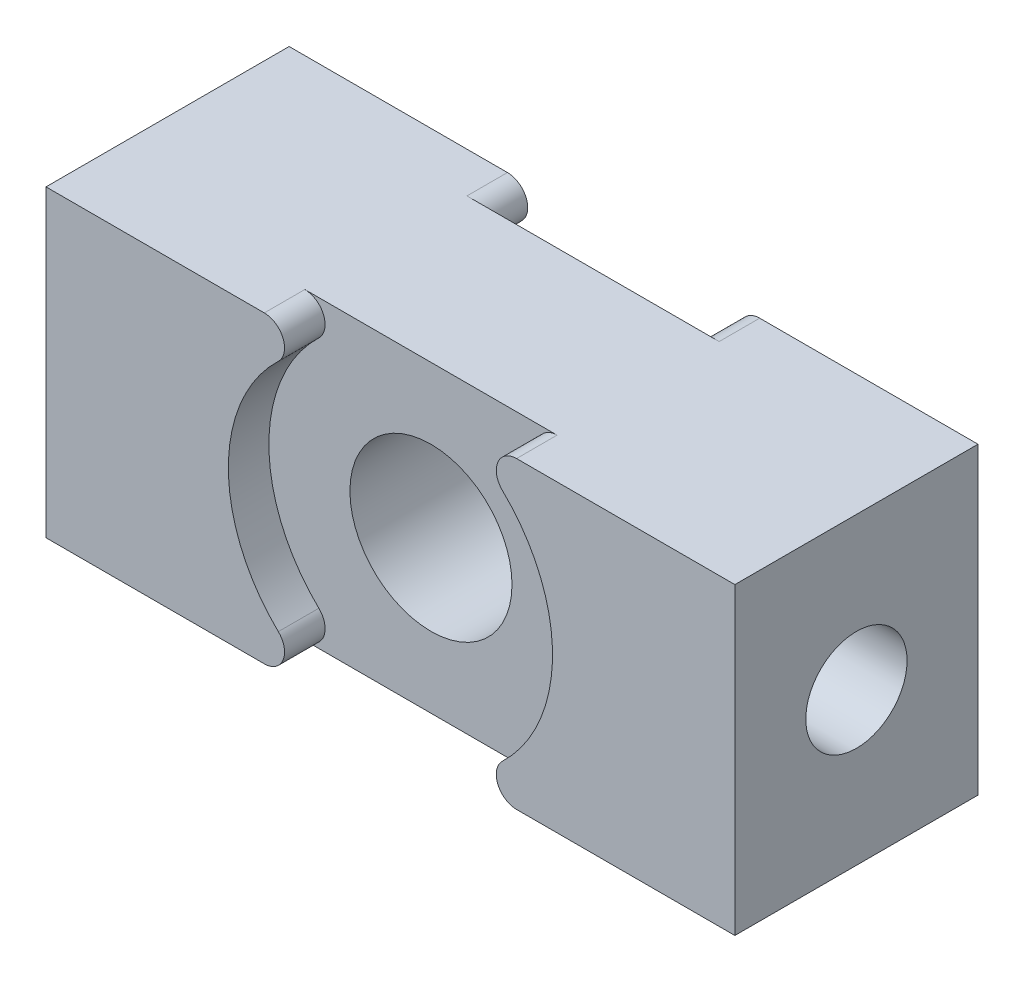
ISO-10303-21;
HEADER;
FILE_DESCRIPTION(('STEP AP214'),'2;1');
FILE_NAME('part.step','',(''),(''),'','','');
FILE_SCHEMA(('AUTOMOTIVE_DESIGN { 1 0 10303 214 1 1 1 1 }'));
ENDSEC;
DATA;
#1=APPLICATION_CONTEXT('core data for automotive mechanical design processes');
#2=APPLICATION_PROTOCOL_DEFINITION('international standard','automotive_design',2000,#1);
#3=PRODUCT_CONTEXT('',#1,'mechanical');
#4=PRODUCT('Part','Part','',(#3));
#5=PRODUCT_RELATED_PRODUCT_CATEGORY('part','',(#4));
#6=PRODUCT_DEFINITION_FORMATION('','',#4);
#7=PRODUCT_DEFINITION_CONTEXT('part definition',#1,'design');
#8=PRODUCT_DEFINITION('design','',#6,#7);
#9=PRODUCT_DEFINITION_SHAPE('','',#8);
#10=(LENGTH_UNIT() NAMED_UNIT(*) SI_UNIT(.MILLI.,.METRE.));
#11=(NAMED_UNIT(*) PLANE_ANGLE_UNIT() SI_UNIT($,.RADIAN.));
#12=(NAMED_UNIT(*) SI_UNIT($,.STERADIAN.) SOLID_ANGLE_UNIT());
#13=UNCERTAINTY_MEASURE_WITH_UNIT(LENGTH_MEASURE(1.E-05),#10,'distance_accuracy_value','');
#14=(GEOMETRIC_REPRESENTATION_CONTEXT(3) GLOBAL_UNCERTAINTY_ASSIGNED_CONTEXT((#13)) GLOBAL_UNIT_ASSIGNED_CONTEXT((#10,
#11,#12)) REPRESENTATION_CONTEXT('',''));
#15=CARTESIAN_POINT('',(0.,0.,0.));
#16=DIRECTION('',(0.,0.,1.));
#17=DIRECTION('',(1.,0.,0.));
#18=AXIS2_PLACEMENT_3D('',#15,#16,#17);
#19=CARTESIAN_POINT('',(0.,7.5,6.));
#20=DIRECTION('',(0.,0.,-1.));
#21=DIRECTION('',(-1.,0.,0.));
#22=AXIS2_PLACEMENT_3D('',#19,#20,#21);
#23=CYLINDRICAL_SURFACE('',#22,4.);
#24=CARTESIAN_POINT('',(0.,7.5,4.));
#25=DIRECTION('',(0.,0.,1.));
#26=DIRECTION('',(1.,0.,0.));
#27=AXIS2_PLACEMENT_3D('',#24,#25,#26);
#28=CIRCLE('',#27,4.);
#29=CARTESIAN_POINT('',(4.,7.5,4.));
#30=VERTEX_POINT('',#29);
#31=EDGE_CURVE('E258',#30,#30,#28,.F.);
#32=ORIENTED_EDGE('',*,*,#31,.F.);
#33=EDGE_LOOP('',(#32));
#34=FACE_BOUND('',#33,.T.);
#35=CARTESIAN_POINT('',(0.,7.5,-4.));
#36=DIRECTION('',(0.,0.,-1.));
#37=DIRECTION('',(-1.,0.,0.));
#38=AXIS2_PLACEMENT_3D('',#35,#36,#37);
#39=CIRCLE('',#38,4.);
#40=CARTESIAN_POINT('',(-4.,7.5,-4.));
#41=VERTEX_POINT('',#40);
#42=EDGE_CURVE('E380',#41,#41,#39,.F.);
#43=ORIENTED_EDGE('',*,*,#42,.F.);
#44=EDGE_LOOP('',(#43));
#45=FACE_BOUND('',#44,.T.);
#46=ADVANCED_FACE('F56',(#34,#45),#23,.F.);
#47=CARTESIAN_POINT('',(-17.,15.,-6.));
#48=DIRECTION('',(0.,0.,1.));
#49=DIRECTION('',(1.,0.,0.));
#50=AXIS2_PLACEMENT_3D('',#47,#48,#49);
#51=PLANE('',#50);
#52=DIRECTION('',(-1.,0.,0.));
#53=VECTOR('',#52,1.);
#54=CARTESIAN_POINT('',(-17.,15.,-6.));
#55=LINE('',#54,#53);
#56=CARTESIAN_POINT('',(-6.22494979899437,15.,-6.));
#57=VERTEX_POINT('',#56);
#58=CARTESIAN_POINT('',(-17.,15.,-6.));
#59=VERTEX_POINT('',#58);
#60=EDGE_CURVE('E223',#57,#59,#55,.T.);
#61=ORIENTED_EDGE('',*,*,#60,.F.);
#62=CARTESIAN_POINT('',(-6.22494979899437,14.,-6.));
#63=DIRECTION('',(0.,0.,1.));
#64=DIRECTION('',(1.,0.,0.));
#65=AXIS2_PLACEMENT_3D('',#62,#63,#64);
#66=CIRCLE('',#65,1.);
#67=CARTESIAN_POINT('',(-5.53328871021722,13.2777777777778,-6.));
#68=VERTEX_POINT('',#67);
#69=EDGE_CURVE('E311',#57,#68,#66,.F.);
#70=ORIENTED_EDGE('',*,*,#69,.T.);
#71=CARTESIAN_POINT('',(0.,7.5,-6.));
#72=DIRECTION('',(0.,0.,-1.));
#73=DIRECTION('',(-1.,0.,0.));
#74=AXIS2_PLACEMENT_3D('',#71,#72,#73);
#75=CIRCLE('',#74,8.);
#76=CARTESIAN_POINT('',(-5.53328871021722,1.72222222222222,-6.));
#77=VERTEX_POINT('',#76);
#78=EDGE_CURVE('E399',#77,#68,#75,.T.);
#79=ORIENTED_EDGE('',*,*,#78,.F.);
#80=CARTESIAN_POINT('',(-6.22494979899437,1.,-6.));
#81=DIRECTION('',(0.,0.,1.));
#82=DIRECTION('',(1.,0.,0.));
#83=AXIS2_PLACEMENT_3D('',#80,#81,#82);
#84=CIRCLE('',#83,1.);
#85=CARTESIAN_POINT('',(-6.22494979899437,0.,-6.));
#86=VERTEX_POINT('',#85);
#87=EDGE_CURVE('E309',#77,#86,#84,.F.);
#88=ORIENTED_EDGE('',*,*,#87,.T.);
#89=DIRECTION('',(-1.,0.,0.));
#90=VECTOR('',#89,1.);
#91=CARTESIAN_POINT('',(-17.,0.,-6.));
#92=LINE('',#91,#90);
#93=CARTESIAN_POINT('',(-17.,0.,-6.));
#94=VERTEX_POINT('',#93);
#95=EDGE_CURVE('E237',#86,#94,#92,.T.);
#96=ORIENTED_EDGE('',*,*,#95,.T.);
#97=DIRECTION('',(0.,-1.,0.));
#98=VECTOR('',#97,1.);
#99=CARTESIAN_POINT('',(-17.,15.,-6.));
#100=LINE('',#99,#98);
#101=EDGE_CURVE('E251',#59,#94,#100,.T.);
#102=ORIENTED_EDGE('',*,*,#101,.F.);
#103=EDGE_LOOP('',(#61,#70,#79,#88,#96,#102));
#104=FACE_BOUND('',#103,.T.);
#105=ADVANCED_FACE('F409',(#104),#51,.F.);
#106=CARTESIAN_POINT('',(-17.,15.,6.));
#107=DIRECTION('',(0.,0.,-1.));
#108=DIRECTION('',(-1.,0.,0.));
#109=AXIS2_PLACEMENT_3D('',#106,#107,#108);
#110=PLANE('',#109);
#111=CARTESIAN_POINT('',(0.,7.5,6.));
#112=DIRECTION('',(0.,0.,1.));
#113=DIRECTION('',(1.,0.,0.));
#114=AXIS2_PLACEMENT_3D('',#111,#112,#113);
#115=CIRCLE('',#114,8.);
#116=CARTESIAN_POINT('',(5.53328871021722,1.72222222222222,6.));
#117=VERTEX_POINT('',#116);
#118=CARTESIAN_POINT('',(5.53328871021722,13.2777777777778,6.));
#119=VERTEX_POINT('',#118);
#120=EDGE_CURVE('E377',#117,#119,#115,.T.);
#121=ORIENTED_EDGE('',*,*,#120,.F.);
#122=CARTESIAN_POINT('',(6.22494979899437,1.,6.));
#123=DIRECTION('',(0.,0.,-1.));
#124=DIRECTION('',(-1.,0.,0.));
#125=AXIS2_PLACEMENT_3D('',#122,#123,#124);
#126=CIRCLE('',#125,1.);
#127=CARTESIAN_POINT('',(6.22494979899437,0.,6.));
#128=VERTEX_POINT('',#127);
#129=EDGE_CURVE('E292',#117,#128,#126,.F.);
#130=ORIENTED_EDGE('',*,*,#129,.T.);
#131=DIRECTION('',(1.,0.,0.));
#132=VECTOR('',#131,1.);
#133=CARTESIAN_POINT('',(-17.,0.,6.));
#134=LINE('',#133,#132);
#135=CARTESIAN_POINT('',(17.,0.,6.));
#136=VERTEX_POINT('',#135);
#137=EDGE_CURVE('E243',#128,#136,#134,.T.);
#138=ORIENTED_EDGE('',*,*,#137,.T.);
#139=DIRECTION('',(0.,-1.,0.));
#140=VECTOR('',#139,1.);
#141=CARTESIAN_POINT('',(17.,15.,6.));
#142=LINE('',#141,#140);
#143=CARTESIAN_POINT('',(17.,15.,6.));
#144=VERTEX_POINT('',#143);
#145=EDGE_CURVE('E234',#144,#136,#142,.T.);
#146=ORIENTED_EDGE('',*,*,#145,.F.);
#147=DIRECTION('',(1.,0.,0.));
#148=VECTOR('',#147,1.);
#149=CARTESIAN_POINT('',(-17.,15.,6.));
#150=LINE('',#149,#148);
#151=CARTESIAN_POINT('',(6.22494979899437,15.,6.));
#152=VERTEX_POINT('',#151);
#153=EDGE_CURVE('E230',#152,#144,#150,.T.);
#154=ORIENTED_EDGE('',*,*,#153,.F.);
#155=CARTESIAN_POINT('',(6.22494979899437,14.,6.));
#156=DIRECTION('',(0.,0.,-1.));
#157=DIRECTION('',(-1.,0.,0.));
#158=AXIS2_PLACEMENT_3D('',#155,#156,#157);
#159=CIRCLE('',#158,1.);
#160=EDGE_CURVE('E290',#152,#119,#159,.F.);
#161=ORIENTED_EDGE('',*,*,#160,.T.);
#162=EDGE_LOOP('',(#121,#130,#138,#146,#154,#161));
#163=FACE_BOUND('',#162,.T.);
#164=ADVANCED_FACE('F392',(#163),#110,.F.);
#165=CARTESIAN_POINT('',(17.,15.,-6.));
#166=DIRECTION('',(-1.,0.,0.));
#167=DIRECTION('',(0.,0.,1.));
#168=AXIS2_PLACEMENT_3D('',#165,#166,#167);
#169=PLANE('',#168);
#170=CARTESIAN_POINT('',(17.,7.5,0.));
#171=DIRECTION('',(1.,0.,0.));
#172=DIRECTION('',(0.,0.,-1.));
#173=AXIS2_PLACEMENT_3D('',#170,#171,#172);
#174=CIRCLE('',#173,2.5);
#175=CARTESIAN_POINT('',(17.,7.5,-2.5));
#176=VERTEX_POINT('',#175);
#177=EDGE_CURVE('E207',#176,#176,#174,.T.);
#178=ORIENTED_EDGE('',*,*,#177,.F.);
#179=EDGE_LOOP('',(#178));
#180=FACE_BOUND('',#179,.T.);
#181=DIRECTION('',(0.,0.,-1.));
#182=VECTOR('',#181,1.);
#183=CARTESIAN_POINT('',(17.,0.,-6.));
#184=LINE('',#183,#182);
#185=CARTESIAN_POINT('',(17.,0.,-6.));
#186=VERTEX_POINT('',#185);
#187=EDGE_CURVE('E219',#136,#186,#184,.T.);
#188=ORIENTED_EDGE('',*,*,#187,.T.);
#189=DIRECTION('',(0.,-1.,0.));
#190=VECTOR('',#189,1.);
#191=CARTESIAN_POINT('',(17.,15.,-6.));
#192=LINE('',#191,#190);
#193=CARTESIAN_POINT('',(17.,15.,-6.));
#194=VERTEX_POINT('',#193);
#195=EDGE_CURVE('E254',#194,#186,#192,.T.);
#196=ORIENTED_EDGE('',*,*,#195,.F.);
#197=DIRECTION('',(0.,0.,-1.));
#198=VECTOR('',#197,1.);
#199=CARTESIAN_POINT('',(17.,15.,-6.));
#200=LINE('',#199,#198);
#201=EDGE_CURVE('E220',#144,#194,#200,.T.);
#202=ORIENTED_EDGE('',*,*,#201,.F.);
#203=ORIENTED_EDGE('',*,*,#145,.T.);
#204=EDGE_LOOP('',(#188,#196,#202,#203));
#205=FACE_BOUND('',#204,.T.);
#206=ADVANCED_FACE('F353',(#180,#205),#169,.F.);
#207=CARTESIAN_POINT('',(6.22494979899437,0.,-6.));
#208=VERTEX_POINT('',#207);
#209=EDGE_CURVE('E238',#186,#208,#92,.T.);
#210=ORIENTED_EDGE('',*,*,#209,.T.);
#211=CARTESIAN_POINT('',(6.22494979899437,1.,-6.));
#212=DIRECTION('',(0.,0.,1.));
#213=DIRECTION('',(1.,0.,0.));
#214=AXIS2_PLACEMENT_3D('',#211,#212,#213);
#215=CIRCLE('',#214,1.);
#216=CARTESIAN_POINT('',(5.53328871021722,1.72222222222222,-6.));
#217=VERTEX_POINT('',#216);
#218=EDGE_CURVE('E315',#208,#217,#215,.F.);
#219=ORIENTED_EDGE('',*,*,#218,.T.);
#220=CARTESIAN_POINT('',(5.53328871021722,13.2777777777778,-6.));
#221=VERTEX_POINT('',#220);
#222=EDGE_CURVE('E397',#221,#217,#75,.T.);
#223=ORIENTED_EDGE('',*,*,#222,.F.);
#224=CARTESIAN_POINT('',(6.22494979899437,14.,-6.));
#225=DIRECTION('',(0.,0.,1.));
#226=DIRECTION('',(1.,0.,0.));
#227=AXIS2_PLACEMENT_3D('',#224,#225,#226);
#228=CIRCLE('',#227,1.);
#229=CARTESIAN_POINT('',(6.22494979899437,15.,-6.));
#230=VERTEX_POINT('',#229);
#231=EDGE_CURVE('E313',#221,#230,#228,.F.);
#232=ORIENTED_EDGE('',*,*,#231,.T.);
#233=EDGE_CURVE('E225',#194,#230,#55,.T.);
#234=ORIENTED_EDGE('',*,*,#233,.F.);
#235=ORIENTED_EDGE('',*,*,#195,.T.);
#236=EDGE_LOOP('',(#210,#219,#223,#232,#234,#235));
#237=FACE_BOUND('',#236,.T.);
#238=ADVANCED_FACE('F348',(#237),#51,.F.);
#239=CARTESIAN_POINT('',(-17.,15.,-6.));
#240=DIRECTION('',(1.,0.,0.));
#241=DIRECTION('',(0.,0.,-1.));
#242=AXIS2_PLACEMENT_3D('',#239,#240,#241);
#243=PLANE('',#242);
#244=CARTESIAN_POINT('',(-17.,7.5,0.));
#245=DIRECTION('',(-1.,0.,0.));
#246=DIRECTION('',(0.,0.,1.));
#247=AXIS2_PLACEMENT_3D('',#244,#245,#246);
#248=CIRCLE('',#247,2.5);
#249=CARTESIAN_POINT('',(-17.,7.5,2.5));
#250=VERTEX_POINT('',#249);
#251=EDGE_CURVE('E206',#250,#250,#248,.T.);
#252=ORIENTED_EDGE('',*,*,#251,.F.);
#253=EDGE_LOOP('',(#252));
#254=FACE_BOUND('',#253,.T.);
#255=DIRECTION('',(0.,0.,1.));
#256=VECTOR('',#255,1.);
#257=CARTESIAN_POINT('',(-17.,0.,-6.));
#258=LINE('',#257,#256);
#259=CARTESIAN_POINT('',(-17.,0.,6.));
#260=VERTEX_POINT('',#259);
#261=EDGE_CURVE('E241',#94,#260,#258,.T.);
#262=ORIENTED_EDGE('',*,*,#261,.T.);
#263=DIRECTION('',(0.,-1.,0.));
#264=VECTOR('',#263,1.);
#265=CARTESIAN_POINT('',(-17.,15.,6.));
#266=LINE('',#265,#264);
#267=CARTESIAN_POINT('',(-17.,15.,6.));
#268=VERTEX_POINT('',#267);
#269=EDGE_CURVE('E248',#268,#260,#266,.T.);
#270=ORIENTED_EDGE('',*,*,#269,.F.);
#271=DIRECTION('',(0.,0.,1.));
#272=VECTOR('',#271,1.);
#273=CARTESIAN_POINT('',(-17.,15.,-6.));
#274=LINE('',#273,#272);
#275=EDGE_CURVE('E228',#59,#268,#274,.T.);
#276=ORIENTED_EDGE('',*,*,#275,.F.);
#277=ORIENTED_EDGE('',*,*,#101,.T.);
#278=EDGE_LOOP('',(#262,#270,#276,#277));
#279=FACE_BOUND('',#278,.T.);
#280=ADVANCED_FACE('F430',(#254,#279),#243,.F.);
#281=CARTESIAN_POINT('',(-6.22494979899437,0.,6.));
#282=VERTEX_POINT('',#281);
#283=EDGE_CURVE('E224',#260,#282,#134,.T.);
#284=ORIENTED_EDGE('',*,*,#283,.T.);
#285=CARTESIAN_POINT('',(-6.22494979899437,1.,6.));
#286=DIRECTION('',(0.,0.,-1.));
#287=DIRECTION('',(-1.,0.,0.));
#288=AXIS2_PLACEMENT_3D('',#285,#286,#287);
#289=CIRCLE('',#288,1.);
#290=CARTESIAN_POINT('',(-5.53328871021722,1.72222222222222,6.));
#291=VERTEX_POINT('',#290);
#292=EDGE_CURVE('E278',#282,#291,#289,.F.);
#293=ORIENTED_EDGE('',*,*,#292,.T.);
#294=CARTESIAN_POINT('',(-5.53328871021722,13.2777777777778,6.));
#295=VERTEX_POINT('',#294);
#296=EDGE_CURVE('E373',#295,#291,#115,.T.);
#297=ORIENTED_EDGE('',*,*,#296,.F.);
#298=CARTESIAN_POINT('',(-6.22494979899437,14.,6.));
#299=DIRECTION('',(0.,0.,-1.));
#300=DIRECTION('',(-1.,0.,0.));
#301=AXIS2_PLACEMENT_3D('',#298,#299,#300);
#302=CIRCLE('',#301,1.);
#303=CARTESIAN_POINT('',(-6.22494979899437,15.,6.));
#304=VERTEX_POINT('',#303);
#305=EDGE_CURVE('E276',#295,#304,#302,.F.);
#306=ORIENTED_EDGE('',*,*,#305,.T.);
#307=EDGE_CURVE('E231',#268,#304,#150,.T.);
#308=ORIENTED_EDGE('',*,*,#307,.F.);
#309=ORIENTED_EDGE('',*,*,#269,.T.);
#310=EDGE_LOOP('',(#284,#293,#297,#306,#308,#309));
#311=FACE_BOUND('',#310,.T.);
#312=ADVANCED_FACE('F425',(#311),#110,.F.);
#313=CARTESIAN_POINT('',(0.,15.,0.));
#314=DIRECTION('',(0.,1.,0.));
#315=DIRECTION('',(0.,0.,1.));
#316=AXIS2_PLACEMENT_3D('',#313,#314,#315);
#317=PLANE('',#316);
#318=DIRECTION('',(1.,0.,0.));
#319=VECTOR('',#318,1.);
#320=CARTESIAN_POINT('',(0.,15.,4.));
#321=LINE('',#320,#319);
#322=CARTESIAN_POINT('',(-6.22494979899437,15.,4.));
#323=VERTEX_POINT('',#322);
#324=CARTESIAN_POINT('',(6.22494979899437,15.,4.));
#325=VERTEX_POINT('',#324);
#326=EDGE_CURVE('E213',#323,#325,#321,.T.);
#327=ORIENTED_EDGE('',*,*,#326,.T.);
#328=DIRECTION('',(0.,0.,-1.));
#329=VECTOR('',#328,1.);
#330=CARTESIAN_POINT('',(6.22494979899437,15.,6.));
#331=LINE('',#330,#329);
#332=EDGE_CURVE('E302',#325,#152,#331,.F.);
#333=ORIENTED_EDGE('',*,*,#332,.T.);
#334=ORIENTED_EDGE('',*,*,#153,.T.);
#335=ORIENTED_EDGE('',*,*,#201,.T.);
#336=ORIENTED_EDGE('',*,*,#233,.T.);
#337=DIRECTION('',(0.,0.,1.));
#338=VECTOR('',#337,1.);
#339=CARTESIAN_POINT('',(6.22494979899437,15.,-4.));
#340=LINE('',#339,#338);
#341=CARTESIAN_POINT('',(6.22494979899437,15.,-4.));
#342=VERTEX_POINT('',#341);
#343=EDGE_CURVE('E294',#230,#342,#340,.T.);
#344=ORIENTED_EDGE('',*,*,#343,.T.);
#345=DIRECTION('',(-1.,0.,0.));
#346=VECTOR('',#345,1.);
#347=CARTESIAN_POINT('',(0.,15.,-4.));
#348=LINE('',#347,#346);
#349=CARTESIAN_POINT('',(-6.22494979899437,15.,-4.));
#350=VERTEX_POINT('',#349);
#351=EDGE_CURVE('E404',#342,#350,#348,.T.);
#352=ORIENTED_EDGE('',*,*,#351,.T.);
#353=DIRECTION('',(0.,0.,1.));
#354=VECTOR('',#353,1.);
#355=CARTESIAN_POINT('',(-6.22494979899437,15.,-6.));
#356=LINE('',#355,#354);
#357=EDGE_CURVE('E297',#350,#57,#356,.F.);
#358=ORIENTED_EDGE('',*,*,#357,.T.);
#359=ORIENTED_EDGE('',*,*,#60,.T.);
#360=ORIENTED_EDGE('',*,*,#275,.T.);
#361=ORIENTED_EDGE('',*,*,#307,.T.);
#362=DIRECTION('',(0.,0.,-1.));
#363=VECTOR('',#362,1.);
#364=CARTESIAN_POINT('',(-6.22494979899437,15.,4.));
#365=LINE('',#364,#363);
#366=EDGE_CURVE('E299',#304,#323,#365,.T.);
#367=ORIENTED_EDGE('',*,*,#366,.T.);
#368=EDGE_LOOP('',(#327,#333,#334,#335,#336,#344,#352,#358,#359,#360,#361,#367));
#369=FACE_BOUND('',#368,.T.);
#370=ADVANCED_FACE('F384',(#369),#317,.T.);
#371=CARTESIAN_POINT('',(0.,0.,0.));
#372=DIRECTION('',(0.,1.,0.));
#373=DIRECTION('',(0.,0.,1.));
#374=AXIS2_PLACEMENT_3D('',#371,#372,#373);
#375=PLANE('',#374);
#376=DIRECTION('',(1.,0.,0.));
#377=VECTOR('',#376,1.);
#378=CARTESIAN_POINT('',(0.,0.,4.));
#379=LINE('',#378,#377);
#380=CARTESIAN_POINT('',(-6.22494979899437,0.,4.));
#381=VERTEX_POINT('',#380);
#382=CARTESIAN_POINT('',(6.22494979899437,0.,4.));
#383=VERTEX_POINT('',#382);
#384=EDGE_CURVE('E261',#381,#383,#379,.T.);
#385=ORIENTED_EDGE('',*,*,#384,.F.);
#386=DIRECTION('',(0.,0.,1.));
#387=VECTOR('',#386,1.);
#388=CARTESIAN_POINT('',(-6.22494979899437,0.,0.));
#389=LINE('',#388,#387);
#390=EDGE_CURVE('E273',#381,#282,#389,.T.);
#391=ORIENTED_EDGE('',*,*,#390,.T.);
#392=ORIENTED_EDGE('',*,*,#283,.F.);
#393=ORIENTED_EDGE('',*,*,#261,.F.);
#394=ORIENTED_EDGE('',*,*,#95,.F.);
#395=DIRECTION('',(0.,0.,-1.));
#396=VECTOR('',#395,1.);
#397=CARTESIAN_POINT('',(-6.22494979899437,0.,0.));
#398=LINE('',#397,#396);
#399=CARTESIAN_POINT('',(-6.22494979899437,0.,-4.));
#400=VERTEX_POINT('',#399);
#401=EDGE_CURVE('E267',#86,#400,#398,.F.);
#402=ORIENTED_EDGE('',*,*,#401,.T.);
#403=DIRECTION('',(-1.,0.,0.));
#404=VECTOR('',#403,1.);
#405=CARTESIAN_POINT('',(0.,0.,-4.));
#406=LINE('',#405,#404);
#407=CARTESIAN_POINT('',(6.22494979899437,0.,-4.));
#408=VERTEX_POINT('',#407);
#409=EDGE_CURVE('E257',#408,#400,#406,.T.);
#410=ORIENTED_EDGE('',*,*,#409,.F.);
#411=DIRECTION('',(0.,0.,-1.));
#412=VECTOR('',#411,1.);
#413=CARTESIAN_POINT('',(6.22494979899437,0.,0.));
#414=LINE('',#413,#412);
#415=EDGE_CURVE('E264',#408,#208,#414,.T.);
#416=ORIENTED_EDGE('',*,*,#415,.T.);
#417=ORIENTED_EDGE('',*,*,#209,.F.);
#418=ORIENTED_EDGE('',*,*,#187,.F.);
#419=ORIENTED_EDGE('',*,*,#137,.F.);
#420=DIRECTION('',(0.,0.,1.));
#421=VECTOR('',#420,1.);
#422=CARTESIAN_POINT('',(6.22494979899437,0.,0.));
#423=LINE('',#422,#421);
#424=EDGE_CURVE('E270',#128,#383,#423,.F.);
#425=ORIENTED_EDGE('',*,*,#424,.T.);
#426=EDGE_LOOP('',(#385,#391,#392,#393,#394,#402,#410,#416,#417,#418,#419,#425));
#427=FACE_BOUND('',#426,.T.);
#428=ADVANCED_FACE('F345',(#427),#375,.F.);
#429=CARTESIAN_POINT('',(-6.99999999999999,7.5,0.));
#430=DIRECTION('',(-1.,0.,0.));
#431=DIRECTION('',(0.,0.,1.));
#432=AXIS2_PLACEMENT_3D('',#429,#430,#431);
#433=CONICAL_SURFACE('',#432,2.5,1.02974425867665);
#434=CARTESIAN_POINT('',(-5.49784845243109,7.5,0.));
#435=VERTEX_POINT('',#434);
#436=VERTEX_LOOP('',#435);
#437=FACE_BOUND('',#436,.T.);
#438=CARTESIAN_POINT('',(-6.99999999999999,7.5,0.));
#439=DIRECTION('',(-1.,0.,0.));
#440=DIRECTION('',(0.,0.,1.));
#441=AXIS2_PLACEMENT_3D('',#438,#439,#440);
#442=CIRCLE('',#441,2.5);
#443=CARTESIAN_POINT('',(-6.99999999999999,7.5,2.5));
#444=VERTEX_POINT('',#443);
#445=EDGE_CURVE('E210',#444,#444,#442,.T.);
#446=ORIENTED_EDGE('',*,*,#445,.T.);
#447=EDGE_LOOP('',(#446));
#448=FACE_BOUND('',#447,.T.);
#449=ADVANCED_FACE('F421',(#437,#448),#433,.F.);
#450=CARTESIAN_POINT('',(-17.,7.5,0.));
#451=DIRECTION('',(-1.,0.,0.));
#452=DIRECTION('',(0.,0.,1.));
#453=AXIS2_PLACEMENT_3D('',#450,#451,#452);
#454=CYLINDRICAL_SURFACE('',#453,2.5);
#455=ORIENTED_EDGE('',*,*,#445,.F.);
#456=EDGE_LOOP('',(#455));
#457=FACE_BOUND('',#456,.T.);
#458=ORIENTED_EDGE('',*,*,#251,.T.);
#459=EDGE_LOOP('',(#458));
#460=FACE_BOUND('',#459,.T.);
#461=ADVANCED_FACE('F200',(#457,#460),#454,.F.);
#462=CARTESIAN_POINT('',(7.00000000000002,7.5,0.));
#463=DIRECTION('',(1.,0.,0.));
#464=DIRECTION('',(0.,0.,-1.));
#465=AXIS2_PLACEMENT_3D('',#462,#463,#464);
#466=CONICAL_SURFACE('',#465,2.5,1.02974425867665);
#467=CARTESIAN_POINT('',(5.49784845243112,7.5,0.));
#468=VERTEX_POINT('',#467);
#469=VERTEX_LOOP('',#468);
#470=FACE_BOUND('',#469,.T.);
#471=CARTESIAN_POINT('',(7.00000000000002,7.5,0.));
#472=DIRECTION('',(1.,0.,0.));
#473=DIRECTION('',(0.,0.,-1.));
#474=AXIS2_PLACEMENT_3D('',#471,#472,#473);
#475=CIRCLE('',#474,2.5);
#476=CARTESIAN_POINT('',(7.00000000000002,7.5,-2.5));
#477=VERTEX_POINT('',#476);
#478=EDGE_CURVE('E204',#477,#477,#475,.T.);
#479=ORIENTED_EDGE('',*,*,#478,.T.);
#480=EDGE_LOOP('',(#479));
#481=FACE_BOUND('',#480,.T.);
#482=ADVANCED_FACE('F196',(#470,#481),#466,.F.);
#483=CARTESIAN_POINT('',(17.,7.5,0.));
#484=DIRECTION('',(1.,0.,0.));
#485=DIRECTION('',(0.,0.,-1.));
#486=AXIS2_PLACEMENT_3D('',#483,#484,#485);
#487=CYLINDRICAL_SURFACE('',#486,2.5);
#488=ORIENTED_EDGE('',*,*,#478,.F.);
#489=EDGE_LOOP('',(#488));
#490=FACE_BOUND('',#489,.T.);
#491=ORIENTED_EDGE('',*,*,#177,.T.);
#492=EDGE_LOOP('',(#491));
#493=FACE_BOUND('',#492,.T.);
#494=ADVANCED_FACE('F199',(#490,#493),#487,.F.);
#495=CARTESIAN_POINT('',(0.,7.5,4.));
#496=DIRECTION('',(0.,0.,1.));
#497=DIRECTION('',(1.,0.,0.));
#498=AXIS2_PLACEMENT_3D('',#495,#496,#497);
#499=CYLINDRICAL_SURFACE('',#498,8.);
#500=ORIENTED_EDGE('',*,*,#296,.T.);
#501=DIRECTION('',(0.,0.,1.));
#502=VECTOR('',#501,1.);
#503=CARTESIAN_POINT('',(-5.53328871021722,1.72222222222222,4.));
#504=LINE('',#503,#502);
#505=CARTESIAN_POINT('',(-5.53328871021722,1.72222222222222,4.));
#506=VERTEX_POINT('',#505);
#507=EDGE_CURVE('E283',#291,#506,#504,.F.);
#508=ORIENTED_EDGE('',*,*,#507,.T.);
#509=CARTESIAN_POINT('',(0.,7.5,4.));
#510=DIRECTION('',(0.,0.,1.));
#511=DIRECTION('',(1.,0.,0.));
#512=AXIS2_PLACEMENT_3D('',#509,#510,#511);
#513=CIRCLE('',#512,8.);
#514=CARTESIAN_POINT('',(-5.53328871021722,13.2777777777778,4.));
#515=VERTEX_POINT('',#514);
#516=EDGE_CURVE('E262',#515,#506,#513,.T.);
#517=ORIENTED_EDGE('',*,*,#516,.F.);
#518=DIRECTION('',(0.,0.,1.));
#519=VECTOR('',#518,1.);
#520=CARTESIAN_POINT('',(-5.53328871021722,13.2777777777778,4.));
#521=LINE('',#520,#519);
#522=EDGE_CURVE('E280',#515,#295,#521,.T.);
#523=ORIENTED_EDGE('',*,*,#522,.T.);
#524=EDGE_LOOP('',(#500,#508,#517,#523));
#525=FACE_BOUND('',#524,.T.);
#526=ADVANCED_FACE('F557',(#525),#499,.F.);
#527=CARTESIAN_POINT('',(5.53328871021722,1.72222222222222,4.));
#528=VERTEX_POINT('',#527);
#529=CARTESIAN_POINT('',(5.53328871021722,13.2777777777778,4.));
#530=VERTEX_POINT('',#529);
#531=EDGE_CURVE('E367',#528,#530,#513,.T.);
#532=ORIENTED_EDGE('',*,*,#531,.F.);
#533=DIRECTION('',(0.,0.,1.));
#534=VECTOR('',#533,1.);
#535=CARTESIAN_POINT('',(5.53328871021722,1.72222222222222,4.));
#536=LINE('',#535,#534);
#537=EDGE_CURVE('E288',#528,#117,#536,.T.);
#538=ORIENTED_EDGE('',*,*,#537,.T.);
#539=ORIENTED_EDGE('',*,*,#120,.T.);
#540=DIRECTION('',(0.,0.,1.));
#541=VECTOR('',#540,1.);
#542=CARTESIAN_POINT('',(5.53328871021722,13.2777777777778,4.));
#543=LINE('',#542,#541);
#544=EDGE_CURVE('E285',#119,#530,#543,.F.);
#545=ORIENTED_EDGE('',*,*,#544,.T.);
#546=EDGE_LOOP('',(#532,#538,#539,#545));
#547=FACE_BOUND('',#546,.T.);
#548=ADVANCED_FACE('F369',(#547),#499,.F.);
#549=CARTESIAN_POINT('',(0.,7.5,4.));
#550=DIRECTION('',(0.,0.,1.));
#551=DIRECTION('',(1.,0.,0.));
#552=AXIS2_PLACEMENT_3D('',#549,#550,#551);
#553=PLANE('',#552);
#554=ORIENTED_EDGE('',*,*,#31,.T.);
#555=EDGE_LOOP('',(#554));
#556=FACE_BOUND('',#555,.T.);
#557=ORIENTED_EDGE('',*,*,#326,.F.);
#558=CARTESIAN_POINT('',(-6.22494979899437,14.,4.));
#559=DIRECTION('',(0.,0.,1.));
#560=DIRECTION('',(1.,0.,0.));
#561=AXIS2_PLACEMENT_3D('',#558,#559,#560);
#562=CIRCLE('',#561,1.);
#563=EDGE_CURVE('E329',#323,#515,#562,.F.);
#564=ORIENTED_EDGE('',*,*,#563,.T.);
#565=ORIENTED_EDGE('',*,*,#516,.T.);
#566=CARTESIAN_POINT('',(-6.22494979899437,1.,4.));
#567=DIRECTION('',(0.,0.,1.));
#568=DIRECTION('',(1.,0.,0.));
#569=AXIS2_PLACEMENT_3D('',#566,#567,#568);
#570=CIRCLE('',#569,1.);
#571=EDGE_CURVE('E321',#506,#381,#570,.F.);
#572=ORIENTED_EDGE('',*,*,#571,.T.);
#573=ORIENTED_EDGE('',*,*,#384,.T.);
#574=CARTESIAN_POINT('',(6.22494979899437,1.,4.));
#575=DIRECTION('',(0.,0.,1.));
#576=DIRECTION('',(1.,0.,0.));
#577=AXIS2_PLACEMENT_3D('',#574,#575,#576);
#578=CIRCLE('',#577,1.);
#579=EDGE_CURVE('E324',#383,#528,#578,.F.);
#580=ORIENTED_EDGE('',*,*,#579,.T.);
#581=ORIENTED_EDGE('',*,*,#531,.T.);
#582=CARTESIAN_POINT('',(6.22494979899437,14.,4.));
#583=DIRECTION('',(0.,0.,1.));
#584=DIRECTION('',(1.,0.,0.));
#585=AXIS2_PLACEMENT_3D('',#582,#583,#584);
#586=CIRCLE('',#585,1.);
#587=EDGE_CURVE('E326',#530,#325,#586,.F.);
#588=ORIENTED_EDGE('',*,*,#587,.T.);
#589=EDGE_LOOP('',(#557,#564,#565,#572,#573,#580,#581,#588));
#590=FACE_BOUND('',#589,.T.);
#591=ADVANCED_FACE('F366',(#556,#590),#553,.T.);
#592=CARTESIAN_POINT('',(0.,7.5,-4.));
#593=DIRECTION('',(0.,0.,-1.));
#594=DIRECTION('',(-1.,0.,0.));
#595=AXIS2_PLACEMENT_3D('',#592,#593,#594);
#596=CYLINDRICAL_SURFACE('',#595,8.);
#597=ORIENTED_EDGE('',*,*,#222,.T.);
#598=DIRECTION('',(0.,0.,-1.));
#599=VECTOR('',#598,1.);
#600=CARTESIAN_POINT('',(5.53328871021722,1.72222222222222,-4.));
#601=LINE('',#600,#599);
#602=CARTESIAN_POINT('',(5.53328871021722,1.72222222222222,-4.));
#603=VERTEX_POINT('',#602);
#604=EDGE_CURVE('E71',#217,#603,#601,.F.);
#605=ORIENTED_EDGE('',*,*,#604,.T.);
#606=CARTESIAN_POINT('',(0.,7.5,-4.));
#607=DIRECTION('',(0.,0.,-1.));
#608=DIRECTION('',(-1.,0.,0.));
#609=AXIS2_PLACEMENT_3D('',#606,#607,#608);
#610=CIRCLE('',#609,8.);
#611=CARTESIAN_POINT('',(5.53328871021722,13.2777777777778,-4.));
#612=VERTEX_POINT('',#611);
#613=EDGE_CURVE('E341',#612,#603,#610,.T.);
#614=ORIENTED_EDGE('',*,*,#613,.F.);
#615=DIRECTION('',(0.,0.,-1.));
#616=VECTOR('',#615,1.);
#617=CARTESIAN_POINT('',(5.53328871021722,13.2777777777778,-4.));
#618=LINE('',#617,#616);
#619=EDGE_CURVE('E317',#612,#221,#618,.T.);
#620=ORIENTED_EDGE('',*,*,#619,.T.);
#621=EDGE_LOOP('',(#597,#605,#614,#620));
#622=FACE_BOUND('',#621,.T.);
#623=ADVANCED_FACE('F396',(#622),#596,.F.);
#624=ORIENTED_EDGE('',*,*,#78,.T.);
#625=DIRECTION('',(0.,0.,-1.));
#626=VECTOR('',#625,1.);
#627=CARTESIAN_POINT('',(-5.53328871021722,13.2777777777778,-4.));
#628=LINE('',#627,#626);
#629=CARTESIAN_POINT('',(-5.53328871021722,13.2777777777778,-4.));
#630=VERTEX_POINT('',#629);
#631=EDGE_CURVE('E306',#68,#630,#628,.F.);
#632=ORIENTED_EDGE('',*,*,#631,.T.);
#633=CARTESIAN_POINT('',(-5.53328871021722,1.72222222222222,-4.));
#634=VERTEX_POINT('',#633);
#635=EDGE_CURVE('E398',#634,#630,#610,.T.);
#636=ORIENTED_EDGE('',*,*,#635,.F.);
#637=DIRECTION('',(0.,0.,-1.));
#638=VECTOR('',#637,1.);
#639=CARTESIAN_POINT('',(-5.53328871021722,1.72222222222222,-4.));
#640=LINE('',#639,#638);
#641=EDGE_CURVE('E304',#634,#77,#640,.T.);
#642=ORIENTED_EDGE('',*,*,#641,.T.);
#643=EDGE_LOOP('',(#624,#632,#636,#642));
#644=FACE_BOUND('',#643,.T.);
#645=ADVANCED_FACE('F514',(#644),#596,.F.);
#646=CARTESIAN_POINT('',(0.,7.5,-4.));
#647=DIRECTION('',(0.,0.,-1.));
#648=DIRECTION('',(-1.,0.,0.));
#649=AXIS2_PLACEMENT_3D('',#646,#647,#648);
#650=PLANE('',#649);
#651=ORIENTED_EDGE('',*,*,#351,.F.);
#652=CARTESIAN_POINT('',(6.22494979899437,14.,-4.));
#653=DIRECTION('',(0.,0.,-1.));
#654=DIRECTION('',(-1.,0.,0.));
#655=AXIS2_PLACEMENT_3D('',#652,#653,#654);
#656=CIRCLE('',#655,1.);
#657=EDGE_CURVE('E13',#342,#612,#656,.F.);
#658=ORIENTED_EDGE('',*,*,#657,.T.);
#659=ORIENTED_EDGE('',*,*,#613,.T.);
#660=CARTESIAN_POINT('',(6.22494979899437,1.,-4.));
#661=DIRECTION('',(0.,0.,-1.));
#662=DIRECTION('',(-1.,0.,0.));
#663=AXIS2_PLACEMENT_3D('',#660,#661,#662);
#664=CIRCLE('',#663,1.);
#665=EDGE_CURVE('E64',#603,#408,#664,.F.);
#666=ORIENTED_EDGE('',*,*,#665,.T.);
#667=ORIENTED_EDGE('',*,*,#409,.T.);
#668=CARTESIAN_POINT('',(-6.22494979899437,1.,-4.));
#669=DIRECTION('',(0.,0.,-1.));
#670=DIRECTION('',(-1.,0.,0.));
#671=AXIS2_PLACEMENT_3D('',#668,#669,#670);
#672=CIRCLE('',#671,1.);
#673=EDGE_CURVE('E334',#400,#634,#672,.F.);
#674=ORIENTED_EDGE('',*,*,#673,.T.);
#675=ORIENTED_EDGE('',*,*,#635,.T.);
#676=CARTESIAN_POINT('',(-6.22494979899437,14.,-4.));
#677=DIRECTION('',(0.,0.,-1.));
#678=DIRECTION('',(-1.,0.,0.));
#679=AXIS2_PLACEMENT_3D('',#676,#677,#678);
#680=CIRCLE('',#679,1.);
#681=EDGE_CURVE('E331',#630,#350,#680,.F.);
#682=ORIENTED_EDGE('',*,*,#681,.T.);
#683=EDGE_LOOP('',(#651,#658,#659,#666,#667,#674,#675,#682));
#684=FACE_BOUND('',#683,.T.);
#685=ORIENTED_EDGE('',*,*,#42,.T.);
#686=EDGE_LOOP('',(#685));
#687=FACE_BOUND('',#686,.T.);
#688=ADVANCED_FACE('F338',(#684,#687),#650,.T.);
#689=CARTESIAN_POINT('',(-6.22494979899437,1.,4.));
#690=DIRECTION('',(0.,0.,1.));
#691=DIRECTION('',(1.,0.,0.));
#692=AXIS2_PLACEMENT_3D('',#689,#690,#691);
#693=CYLINDRICAL_SURFACE('',#692,1.);
#694=ORIENTED_EDGE('',*,*,#571,.F.);
#695=ORIENTED_EDGE('',*,*,#507,.F.);
#696=ORIENTED_EDGE('',*,*,#292,.F.);
#697=ORIENTED_EDGE('',*,*,#390,.F.);
#698=EDGE_LOOP('',(#694,#695,#696,#697));
#699=FACE_BOUND('',#698,.T.);
#700=ADVANCED_FACE('F439',(#699),#693,.T.);
#701=CARTESIAN_POINT('',(6.22494979899437,1.,4.));
#702=DIRECTION('',(0.,0.,1.));
#703=DIRECTION('',(1.,0.,0.));
#704=AXIS2_PLACEMENT_3D('',#701,#702,#703);
#705=CYLINDRICAL_SURFACE('',#704,1.);
#706=ORIENTED_EDGE('',*,*,#129,.F.);
#707=ORIENTED_EDGE('',*,*,#537,.F.);
#708=ORIENTED_EDGE('',*,*,#579,.F.);
#709=ORIENTED_EDGE('',*,*,#424,.F.);
#710=EDGE_LOOP('',(#706,#707,#708,#709));
#711=FACE_BOUND('',#710,.T.);
#712=ADVANCED_FACE('F361',(#711),#705,.T.);
#713=CARTESIAN_POINT('',(6.22494979899437,14.,4.));
#714=DIRECTION('',(0.,0.,1.));
#715=DIRECTION('',(1.,0.,0.));
#716=AXIS2_PLACEMENT_3D('',#713,#714,#715);
#717=CYLINDRICAL_SURFACE('',#716,1.);
#718=ORIENTED_EDGE('',*,*,#160,.F.);
#719=ORIENTED_EDGE('',*,*,#332,.F.);
#720=ORIENTED_EDGE('',*,*,#587,.F.);
#721=ORIENTED_EDGE('',*,*,#544,.F.);
#722=EDGE_LOOP('',(#718,#719,#720,#721));
#723=FACE_BOUND('',#722,.T.);
#724=ADVANCED_FACE('F391',(#723),#717,.T.);
#725=CARTESIAN_POINT('',(-6.22494979899437,14.,4.));
#726=DIRECTION('',(0.,0.,1.));
#727=DIRECTION('',(1.,0.,0.));
#728=AXIS2_PLACEMENT_3D('',#725,#726,#727);
#729=CYLINDRICAL_SURFACE('',#728,1.);
#730=ORIENTED_EDGE('',*,*,#563,.F.);
#731=ORIENTED_EDGE('',*,*,#366,.F.);
#732=ORIENTED_EDGE('',*,*,#305,.F.);
#733=ORIENTED_EDGE('',*,*,#522,.F.);
#734=EDGE_LOOP('',(#730,#731,#732,#733));
#735=FACE_BOUND('',#734,.T.);
#736=ADVANCED_FACE('F447',(#735),#729,.T.);
#737=CARTESIAN_POINT('',(-6.22494979899437,14.,-4.));
#738=DIRECTION('',(0.,0.,-1.));
#739=DIRECTION('',(-1.,0.,0.));
#740=AXIS2_PLACEMENT_3D('',#737,#738,#739);
#741=CYLINDRICAL_SURFACE('',#740,1.);
#742=ORIENTED_EDGE('',*,*,#69,.F.);
#743=ORIENTED_EDGE('',*,*,#357,.F.);
#744=ORIENTED_EDGE('',*,*,#681,.F.);
#745=ORIENTED_EDGE('',*,*,#631,.F.);
#746=EDGE_LOOP('',(#742,#743,#744,#745));
#747=FACE_BOUND('',#746,.T.);
#748=ADVANCED_FACE('F450',(#747),#741,.T.);
#749=CARTESIAN_POINT('',(-6.22494979899437,1.,-4.));
#750=DIRECTION('',(0.,0.,-1.));
#751=DIRECTION('',(-1.,0.,0.));
#752=AXIS2_PLACEMENT_3D('',#749,#750,#751);
#753=CYLINDRICAL_SURFACE('',#752,1.);
#754=ORIENTED_EDGE('',*,*,#87,.F.);
#755=ORIENTED_EDGE('',*,*,#641,.F.);
#756=ORIENTED_EDGE('',*,*,#673,.F.);
#757=ORIENTED_EDGE('',*,*,#401,.F.);
#758=EDGE_LOOP('',(#754,#755,#756,#757));
#759=FACE_BOUND('',#758,.T.);
#760=ADVANCED_FACE('F454',(#759),#753,.T.);
#761=CARTESIAN_POINT('',(6.22494979899437,1.,-4.));
#762=DIRECTION('',(0.,0.,-1.));
#763=DIRECTION('',(-1.,0.,0.));
#764=AXIS2_PLACEMENT_3D('',#761,#762,#763);
#765=CYLINDRICAL_SURFACE('',#764,1.);
#766=ORIENTED_EDGE('',*,*,#665,.F.);
#767=ORIENTED_EDGE('',*,*,#604,.F.);
#768=ORIENTED_EDGE('',*,*,#218,.F.);
#769=ORIENTED_EDGE('',*,*,#415,.F.);
#770=EDGE_LOOP('',(#766,#767,#768,#769));
#771=FACE_BOUND('',#770,.T.);
#772=ADVANCED_FACE('F343',(#771),#765,.T.);
#773=CARTESIAN_POINT('',(6.22494979899437,14.,-4.));
#774=DIRECTION('',(0.,0.,-1.));
#775=DIRECTION('',(-1.,0.,0.));
#776=AXIS2_PLACEMENT_3D('',#773,#774,#775);
#777=CYLINDRICAL_SURFACE('',#776,1.);
#778=ORIENTED_EDGE('',*,*,#657,.F.);
#779=ORIENTED_EDGE('',*,*,#343,.F.);
#780=ORIENTED_EDGE('',*,*,#231,.F.);
#781=ORIENTED_EDGE('',*,*,#619,.F.);
#782=EDGE_LOOP('',(#778,#779,#780,#781));
#783=FACE_BOUND('',#782,.T.);
#784=ADVANCED_FACE('F58',(#783),#777,.T.);
#785=CLOSED_SHELL('',(#46,#105,#164,#206,#238,#280,#312,#370,#428,#449,#461,#482,#494,#526,#548,
#591,#623,#645,#688,#700,#712,#724,#736,#748,#760,#772,#784));
#786=MANIFOLD_SOLID_BREP('B2',#785);
#787=ADVANCED_BREP_SHAPE_REPRESENTATION('',(#18,#786),#14);
#788=SHAPE_DEFINITION_REPRESENTATION(#9,#787);
ENDSEC;
END-ISO-10303-21;
